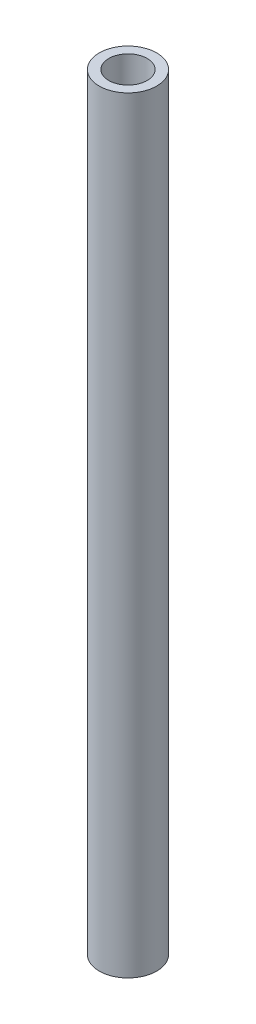
ISO-10303-21;
HEADER;
FILE_DESCRIPTION(('STEP AP214'),'2;1');
FILE_NAME('part.step','',(''),(''),'','','');
FILE_SCHEMA(('AUTOMOTIVE_DESIGN { 1 0 10303 214 1 1 1 1 }'));
ENDSEC;
DATA;
#1=APPLICATION_CONTEXT('core data for automotive mechanical design processes');
#2=APPLICATION_PROTOCOL_DEFINITION('international standard','automotive_design',2000,#1);
#3=PRODUCT_CONTEXT('',#1,'mechanical');
#4=PRODUCT('Part','Part','',(#3));
#5=PRODUCT_RELATED_PRODUCT_CATEGORY('part','',(#4));
#6=PRODUCT_DEFINITION_FORMATION('','',#4);
#7=PRODUCT_DEFINITION_CONTEXT('part definition',#1,'design');
#8=PRODUCT_DEFINITION('design','',#6,#7);
#9=PRODUCT_DEFINITION_SHAPE('','',#8);
#10=(LENGTH_UNIT() NAMED_UNIT(*) SI_UNIT(.MILLI.,.METRE.));
#11=(NAMED_UNIT(*) PLANE_ANGLE_UNIT() SI_UNIT($,.RADIAN.));
#12=(NAMED_UNIT(*) SI_UNIT($,.STERADIAN.) SOLID_ANGLE_UNIT());
#13=UNCERTAINTY_MEASURE_WITH_UNIT(LENGTH_MEASURE(1.E-05),#10,'distance_accuracy_value','');
#14=(GEOMETRIC_REPRESENTATION_CONTEXT(3) GLOBAL_UNCERTAINTY_ASSIGNED_CONTEXT((#13)) GLOBAL_UNIT_ASSIGNED_CONTEXT((#10,
#11,#12)) REPRESENTATION_CONTEXT('',''));
#15=CARTESIAN_POINT('',(0.,0.,0.));
#16=DIRECTION('',(0.,0.,1.));
#17=DIRECTION('',(1.,0.,0.));
#18=AXIS2_PLACEMENT_3D('',#15,#16,#17);
#19=CARTESIAN_POINT('',(0.,80.,0.));
#20=DIRECTION('',(0.,1.,0.));
#21=DIRECTION('',(0.,0.,1.));
#22=AXIS2_PLACEMENT_3D('',#19,#20,#21);
#23=PLANE('',#22);
#24=CARTESIAN_POINT('',(0.,80.,0.));
#25=DIRECTION('',(0.,1.,0.));
#26=DIRECTION('',(0.,0.,1.));
#27=AXIS2_PLACEMENT_3D('',#24,#25,#26);
#28=CIRCLE('',#27,3.);
#29=CARTESIAN_POINT('',(0.,80.,3.));
#30=VERTEX_POINT('',#29);
#31=EDGE_CURVE('E10',#30,#30,#28,.T.);
#32=ORIENTED_EDGE('',*,*,#31,.T.);
#33=EDGE_LOOP('',(#32));
#34=FACE_BOUND('',#33,.T.);
#35=CARTESIAN_POINT('',(0.,80.,0.));
#36=DIRECTION('',(0.,1.,0.));
#37=DIRECTION('',(0.,0.,1.));
#38=AXIS2_PLACEMENT_3D('',#35,#36,#37);
#39=CIRCLE('',#38,2.);
#40=CARTESIAN_POINT('',(0.,80.,2.));
#41=VERTEX_POINT('',#40);
#42=EDGE_CURVE('E44',#41,#41,#39,.T.);
#43=ORIENTED_EDGE('',*,*,#42,.F.);
#44=EDGE_LOOP('',(#43));
#45=FACE_BOUND('',#44,.T.);
#46=ADVANCED_FACE('F33',(#34,#45),#23,.T.);
#47=CARTESIAN_POINT('',(0.,0.,0.));
#48=DIRECTION('',(0.,1.,0.));
#49=DIRECTION('',(0.,0.,1.));
#50=AXIS2_PLACEMENT_3D('',#47,#48,#49);
#51=PLANE('',#50);
#52=CARTESIAN_POINT('',(0.,0.,0.));
#53=DIRECTION('',(0.,1.,0.));
#54=DIRECTION('',(0.,0.,1.));
#55=AXIS2_PLACEMENT_3D('',#52,#53,#54);
#56=CIRCLE('',#55,3.);
#57=CARTESIAN_POINT('',(0.,0.,3.));
#58=VERTEX_POINT('',#57);
#59=EDGE_CURVE('E37',#58,#58,#56,.T.);
#60=ORIENTED_EDGE('',*,*,#59,.F.);
#61=EDGE_LOOP('',(#60));
#62=FACE_BOUND('',#61,.T.);
#63=CARTESIAN_POINT('',(0.,0.,0.));
#64=DIRECTION('',(0.,1.,0.));
#65=DIRECTION('',(0.,0.,1.));
#66=AXIS2_PLACEMENT_3D('',#63,#64,#65);
#67=CIRCLE('',#66,2.);
#68=CARTESIAN_POINT('',(0.,0.,2.));
#69=VERTEX_POINT('',#68);
#70=EDGE_CURVE('E46',#69,#69,#67,.T.);
#71=ORIENTED_EDGE('',*,*,#70,.T.);
#72=EDGE_LOOP('',(#71));
#73=FACE_BOUND('',#72,.T.);
#74=ADVANCED_FACE('F56',(#62,#73),#51,.F.);
#75=CARTESIAN_POINT('',(0.,80.,0.));
#76=DIRECTION('',(0.,-1.,0.));
#77=DIRECTION('',(0.,0.,-1.));
#78=AXIS2_PLACEMENT_3D('',#75,#76,#77);
#79=CYLINDRICAL_SURFACE('',#78,3.);
#80=ORIENTED_EDGE('',*,*,#31,.F.);
#81=EDGE_LOOP('',(#80));
#82=FACE_BOUND('',#81,.T.);
#83=ORIENTED_EDGE('',*,*,#59,.T.);
#84=EDGE_LOOP('',(#83));
#85=FACE_BOUND('',#84,.T.);
#86=ADVANCED_FACE('F35',(#82,#85),#79,.T.);
#87=CARTESIAN_POINT('',(0.,80.,0.));
#88=DIRECTION('',(0.,-1.,0.));
#89=DIRECTION('',(0.,0.,-1.));
#90=AXIS2_PLACEMENT_3D('',#87,#88,#89);
#91=CYLINDRICAL_SURFACE('',#90,2.);
#92=ORIENTED_EDGE('',*,*,#42,.T.);
#93=EDGE_LOOP('',(#92));
#94=FACE_BOUND('',#93,.T.);
#95=ORIENTED_EDGE('',*,*,#70,.F.);
#96=EDGE_LOOP('',(#95));
#97=FACE_BOUND('',#96,.T.);
#98=ADVANCED_FACE('F52',(#94,#97),#91,.F.);
#99=CLOSED_SHELL('',(#46,#74,#86,#98));
#100=MANIFOLD_SOLID_BREP('B2',#99);
#101=ADVANCED_BREP_SHAPE_REPRESENTATION('',(#18,#100),#14);
#102=SHAPE_DEFINITION_REPRESENTATION(#9,#101);
ENDSEC;
END-ISO-10303-21;
